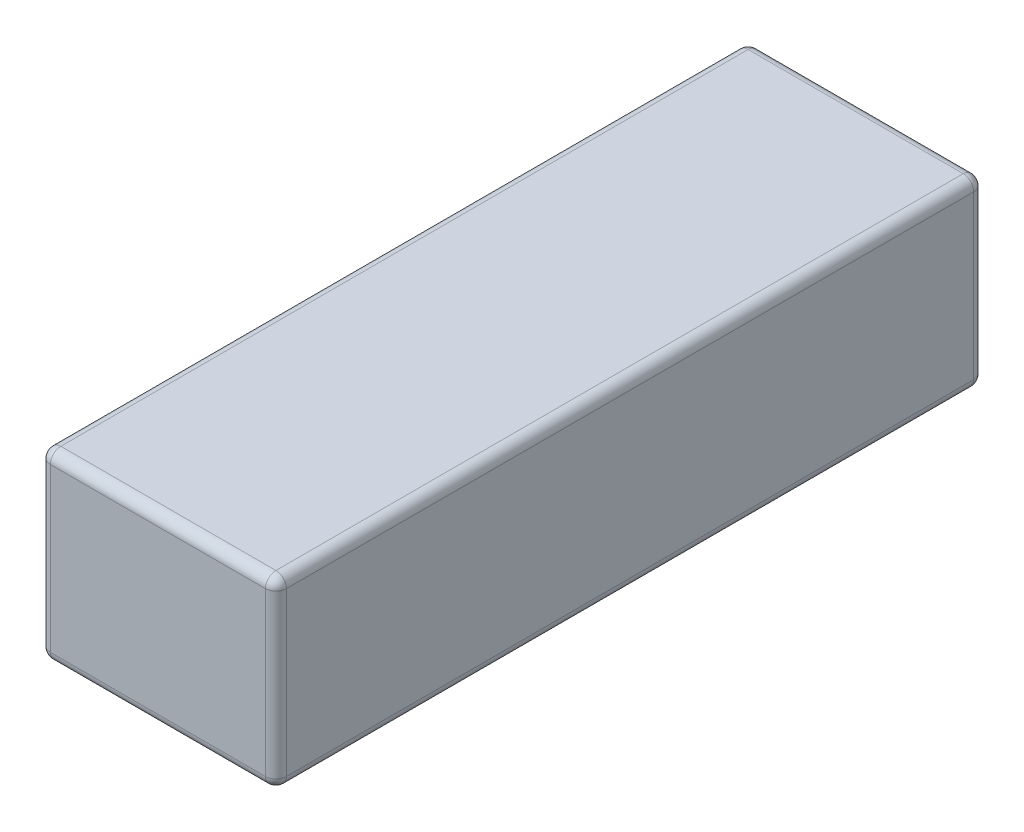
ISO-10303-21;
HEADER;
FILE_DESCRIPTION(('STEP AP214'),'2;1');
FILE_NAME('part.step','',(''),(''),'','','');
FILE_SCHEMA(('AUTOMOTIVE_DESIGN { 1 0 10303 214 1 1 1 1 }'));
ENDSEC;
DATA;
#1=APPLICATION_CONTEXT('core data for automotive mechanical design processes');
#2=APPLICATION_PROTOCOL_DEFINITION('international standard','automotive_design',2000,#1);
#3=PRODUCT_CONTEXT('',#1,'mechanical');
#4=PRODUCT('Part','Part','',(#3));
#5=PRODUCT_RELATED_PRODUCT_CATEGORY('part','',(#4));
#6=PRODUCT_DEFINITION_FORMATION('','',#4);
#7=PRODUCT_DEFINITION_CONTEXT('part definition',#1,'design');
#8=PRODUCT_DEFINITION('design','',#6,#7);
#9=PRODUCT_DEFINITION_SHAPE('','',#8);
#10=(LENGTH_UNIT() NAMED_UNIT(*) SI_UNIT(.MILLI.,.METRE.));
#11=(NAMED_UNIT(*) PLANE_ANGLE_UNIT() SI_UNIT($,.RADIAN.));
#12=(NAMED_UNIT(*) SI_UNIT($,.STERADIAN.) SOLID_ANGLE_UNIT());
#13=UNCERTAINTY_MEASURE_WITH_UNIT(LENGTH_MEASURE(1.E-05),#10,'distance_accuracy_value','');
#14=(GEOMETRIC_REPRESENTATION_CONTEXT(3) GLOBAL_UNCERTAINTY_ASSIGNED_CONTEXT((#13)) GLOBAL_UNIT_ASSIGNED_CONTEXT((#10,
#11,#12)) REPRESENTATION_CONTEXT('',''));
#15=CARTESIAN_POINT('',(0.,0.,0.));
#16=DIRECTION('',(0.,0.,1.));
#17=DIRECTION('',(1.,0.,0.));
#18=AXIS2_PLACEMENT_3D('',#15,#16,#17);
#19=CARTESIAN_POINT('',(22.5,17.5,67.5));
#20=DIRECTION('',(-1.,0.,0.));
#21=DIRECTION('',(0.,0.,1.));
#22=AXIS2_PLACEMENT_3D('',#19,#20,#21);
#23=PLANE('',#22);
#24=DIRECTION('',(0.,1.,0.));
#25=VECTOR('',#24,1.);
#26=CARTESIAN_POINT('',(22.5,-17.5,65.5));
#27=LINE('',#26,#25);
#28=CARTESIAN_POINT('',(22.5,15.5,65.5));
#29=VERTEX_POINT('',#28);
#30=CARTESIAN_POINT('',(22.5,-15.5,65.5));
#31=VERTEX_POINT('',#30);
#32=EDGE_CURVE('E132',#29,#31,#27,.F.);
#33=ORIENTED_EDGE('',*,*,#32,.T.);
#34=DIRECTION('',(0.,0.,-1.));
#35=VECTOR('',#34,1.);
#36=CARTESIAN_POINT('',(22.5,-15.5,67.5));
#37=LINE('',#36,#35);
#38=CARTESIAN_POINT('',(22.5,-15.5,-65.5));
#39=VERTEX_POINT('',#38);
#40=EDGE_CURVE('E169',#31,#39,#37,.T.);
#41=ORIENTED_EDGE('',*,*,#40,.T.);
#42=DIRECTION('',(0.,1.,0.));
#43=VECTOR('',#42,1.);
#44=CARTESIAN_POINT('',(22.5,17.5,-65.5));
#45=LINE('',#44,#43);
#46=CARTESIAN_POINT('',(22.5,15.5,-65.5));
#47=VERTEX_POINT('',#46);
#48=EDGE_CURVE('E166',#39,#47,#45,.T.);
#49=ORIENTED_EDGE('',*,*,#48,.T.);
#50=DIRECTION('',(0.,0.,-1.));
#51=VECTOR('',#50,1.);
#52=CARTESIAN_POINT('',(22.5,15.5,67.5));
#53=LINE('',#52,#51);
#54=EDGE_CURVE('E161',#47,#29,#53,.F.);
#55=ORIENTED_EDGE('',*,*,#54,.T.);
#56=EDGE_LOOP('',(#33,#41,#49,#55));
#57=FACE_BOUND('',#56,.T.);
#58=ADVANCED_FACE('F34',(#57),#23,.F.);
#59=CARTESIAN_POINT('',(-22.5,17.5,67.5));
#60=DIRECTION('',(0.,-1.,0.));
#61=DIRECTION('',(0.,0.,-1.));
#62=AXIS2_PLACEMENT_3D('',#59,#60,#61);
#63=PLANE('',#62);
#64=DIRECTION('',(0.,0.,-1.));
#65=VECTOR('',#64,1.);
#66=CARTESIAN_POINT('',(20.5,17.5,67.5));
#67=LINE('',#66,#65);
#68=CARTESIAN_POINT('',(20.5,17.5,65.5));
#69=VERTEX_POINT('',#68);
#70=CARTESIAN_POINT('',(20.5,17.5,-65.5));
#71=VERTEX_POINT('',#70);
#72=EDGE_CURVE('E57',#69,#71,#67,.T.);
#73=ORIENTED_EDGE('',*,*,#72,.T.);
#74=DIRECTION('',(-1.,0.,0.));
#75=VECTOR('',#74,1.);
#76=CARTESIAN_POINT('',(-22.5,17.5,-65.5));
#77=LINE('',#76,#75);
#78=CARTESIAN_POINT('',(-20.5,17.5,-65.5));
#79=VERTEX_POINT('',#78);
#80=EDGE_CURVE('E11',#71,#79,#77,.T.);
#81=ORIENTED_EDGE('',*,*,#80,.T.);
#82=DIRECTION('',(0.,0.,-1.));
#83=VECTOR('',#82,1.);
#84=CARTESIAN_POINT('',(-20.5,17.5,67.5));
#85=LINE('',#84,#83);
#86=CARTESIAN_POINT('',(-20.5,17.5,65.5));
#87=VERTEX_POINT('',#86);
#88=EDGE_CURVE('E43',#79,#87,#85,.F.);
#89=ORIENTED_EDGE('',*,*,#88,.T.);
#90=DIRECTION('',(-1.,0.,0.));
#91=VECTOR('',#90,1.);
#92=CARTESIAN_POINT('',(22.5,17.5,65.5));
#93=LINE('',#92,#91);
#94=EDGE_CURVE('E198',#87,#69,#93,.F.);
#95=ORIENTED_EDGE('',*,*,#94,.T.);
#96=EDGE_LOOP('',(#73,#81,#89,#95));
#97=FACE_BOUND('',#96,.T.);
#98=ADVANCED_FACE('F332',(#97),#63,.F.);
#99=CARTESIAN_POINT('',(-22.5,17.5,67.5));
#100=DIRECTION('',(1.,0.,0.));
#101=DIRECTION('',(0.,0.,-1.));
#102=AXIS2_PLACEMENT_3D('',#99,#100,#101);
#103=PLANE('',#102);
#104=DIRECTION('',(0.,-1.,0.));
#105=VECTOR('',#104,1.);
#106=CARTESIAN_POINT('',(-22.5,17.5,-65.5));
#107=LINE('',#106,#105);
#108=CARTESIAN_POINT('',(-22.5,15.5,-65.5));
#109=VERTEX_POINT('',#108);
#110=CARTESIAN_POINT('',(-22.5,-15.5,-65.5));
#111=VERTEX_POINT('',#110);
#112=EDGE_CURVE('E173',#109,#111,#107,.T.);
#113=ORIENTED_EDGE('',*,*,#112,.T.);
#114=DIRECTION('',(0.,0.,-1.));
#115=VECTOR('',#114,1.);
#116=CARTESIAN_POINT('',(-22.5,-15.5,67.5));
#117=LINE('',#116,#115);
#118=CARTESIAN_POINT('',(-22.5,-15.5,65.5));
#119=VERTEX_POINT('',#118);
#120=EDGE_CURVE('E178',#111,#119,#117,.F.);
#121=ORIENTED_EDGE('',*,*,#120,.T.);
#122=DIRECTION('',(0.,-1.,0.));
#123=VECTOR('',#122,1.);
#124=CARTESIAN_POINT('',(-22.5,17.5,65.5));
#125=LINE('',#124,#123);
#126=CARTESIAN_POINT('',(-22.5,15.5,65.5));
#127=VERTEX_POINT('',#126);
#128=EDGE_CURVE('E175',#119,#127,#125,.F.);
#129=ORIENTED_EDGE('',*,*,#128,.T.);
#130=DIRECTION('',(0.,0.,-1.));
#131=VECTOR('',#130,1.);
#132=CARTESIAN_POINT('',(-22.5,15.5,67.5));
#133=LINE('',#132,#131);
#134=EDGE_CURVE('E171',#127,#109,#133,.T.);
#135=ORIENTED_EDGE('',*,*,#134,.T.);
#136=EDGE_LOOP('',(#113,#121,#129,#135));
#137=FACE_BOUND('',#136,.T.);
#138=ADVANCED_FACE('F282',(#137),#103,.F.);
#139=CARTESIAN_POINT('',(-22.5,-17.5,67.5));
#140=DIRECTION('',(0.,1.,0.));
#141=DIRECTION('',(0.,0.,1.));
#142=AXIS2_PLACEMENT_3D('',#139,#140,#141);
#143=PLANE('',#142);
#144=DIRECTION('',(1.,0.,0.));
#145=VECTOR('',#144,1.);
#146=CARTESIAN_POINT('',(-22.5,-17.5,65.5));
#147=LINE('',#146,#145);
#148=CARTESIAN_POINT('',(20.5,-17.5,65.5));
#149=VERTEX_POINT('',#148);
#150=CARTESIAN_POINT('',(-20.5,-17.5,65.5));
#151=VERTEX_POINT('',#150);
#152=EDGE_CURVE('E191',#149,#151,#147,.F.);
#153=ORIENTED_EDGE('',*,*,#152,.T.);
#154=DIRECTION('',(0.,0.,-1.));
#155=VECTOR('',#154,1.);
#156=CARTESIAN_POINT('',(-20.5,-17.5,67.5));
#157=LINE('',#156,#155);
#158=CARTESIAN_POINT('',(-20.5,-17.5,-65.5));
#159=VERTEX_POINT('',#158);
#160=EDGE_CURVE('E196',#151,#159,#157,.T.);
#161=ORIENTED_EDGE('',*,*,#160,.T.);
#162=DIRECTION('',(1.,0.,0.));
#163=VECTOR('',#162,1.);
#164=CARTESIAN_POINT('',(-22.5,-17.5,-65.5));
#165=LINE('',#164,#163);
#166=CARTESIAN_POINT('',(20.5,-17.5,-65.5));
#167=VERTEX_POINT('',#166);
#168=EDGE_CURVE('E193',#159,#167,#165,.T.);
#169=ORIENTED_EDGE('',*,*,#168,.T.);
#170=DIRECTION('',(0.,0.,-1.));
#171=VECTOR('',#170,1.);
#172=CARTESIAN_POINT('',(20.5,-17.5,67.5));
#173=LINE('',#172,#171);
#174=EDGE_CURVE('E189',#167,#149,#173,.F.);
#175=ORIENTED_EDGE('',*,*,#174,.T.);
#176=EDGE_LOOP('',(#153,#161,#169,#175));
#177=FACE_BOUND('',#176,.T.);
#178=ADVANCED_FACE('F274',(#177),#143,.F.);
#179=CARTESIAN_POINT('',(0.,0.,67.5));
#180=DIRECTION('',(0.,0.,1.));
#181=DIRECTION('',(1.,0.,0.));
#182=AXIS2_PLACEMENT_3D('',#179,#180,#181);
#183=PLANE('',#182);
#184=DIRECTION('',(0.,-1.,0.));
#185=VECTOR('',#184,1.);
#186=CARTESIAN_POINT('',(-20.5,-17.5,67.5));
#187=LINE('',#186,#185);
#188=CARTESIAN_POINT('',(-20.5,15.5,67.5));
#189=VERTEX_POINT('',#188);
#190=CARTESIAN_POINT('',(-20.5,-15.5,67.5));
#191=VERTEX_POINT('',#190);
#192=EDGE_CURVE('E154',#189,#191,#187,.T.);
#193=ORIENTED_EDGE('',*,*,#192,.T.);
#194=DIRECTION('',(1.,0.,0.));
#195=VECTOR('',#194,1.);
#196=CARTESIAN_POINT('',(22.5,-15.5,67.5));
#197=LINE('',#196,#195);
#198=CARTESIAN_POINT('',(20.5,-15.5,67.5));
#199=VERTEX_POINT('',#198);
#200=EDGE_CURVE('E158',#191,#199,#197,.T.);
#201=ORIENTED_EDGE('',*,*,#200,.T.);
#202=DIRECTION('',(0.,1.,0.));
#203=VECTOR('',#202,1.);
#204=CARTESIAN_POINT('',(20.5,17.5,67.5));
#205=LINE('',#204,#203);
#206=CARTESIAN_POINT('',(20.5,15.5,67.5));
#207=VERTEX_POINT('',#206);
#208=EDGE_CURVE('E130',#199,#207,#205,.T.);
#209=ORIENTED_EDGE('',*,*,#208,.T.);
#210=DIRECTION('',(-1.,0.,0.));
#211=VECTOR('',#210,1.);
#212=CARTESIAN_POINT('',(-22.5,15.5,67.5));
#213=LINE('',#212,#211);
#214=EDGE_CURVE('E148',#207,#189,#213,.T.);
#215=ORIENTED_EDGE('',*,*,#214,.T.);
#216=EDGE_LOOP('',(#193,#201,#209,#215));
#217=FACE_BOUND('',#216,.T.);
#218=ADVANCED_FACE('F156',(#217),#183,.T.);
#219=CARTESIAN_POINT('',(0.,0.,-67.5));
#220=DIRECTION('',(0.,0.,1.));
#221=DIRECTION('',(1.,0.,0.));
#222=AXIS2_PLACEMENT_3D('',#219,#220,#221);
#223=PLANE('',#222);
#224=DIRECTION('',(0.,1.,0.));
#225=VECTOR('',#224,1.);
#226=CARTESIAN_POINT('',(20.5,0.,-67.5));
#227=LINE('',#226,#225);
#228=CARTESIAN_POINT('',(20.5,15.5,-67.5));
#229=VERTEX_POINT('',#228);
#230=CARTESIAN_POINT('',(20.5,-15.5,-67.5));
#231=VERTEX_POINT('',#230);
#232=EDGE_CURVE('E182',#229,#231,#227,.F.);
#233=ORIENTED_EDGE('',*,*,#232,.T.);
#234=DIRECTION('',(1.,0.,0.));
#235=VECTOR('',#234,1.);
#236=CARTESIAN_POINT('',(0.,-15.5,-67.5));
#237=LINE('',#236,#235);
#238=CARTESIAN_POINT('',(-20.5,-15.5,-67.5));
#239=VERTEX_POINT('',#238);
#240=EDGE_CURVE('E187',#231,#239,#237,.F.);
#241=ORIENTED_EDGE('',*,*,#240,.T.);
#242=DIRECTION('',(0.,-1.,0.));
#243=VECTOR('',#242,1.);
#244=CARTESIAN_POINT('',(-20.5,0.,-67.5));
#245=LINE('',#244,#243);
#246=CARTESIAN_POINT('',(-20.5,15.5,-67.5));
#247=VERTEX_POINT('',#246);
#248=EDGE_CURVE('E184',#239,#247,#245,.F.);
#249=ORIENTED_EDGE('',*,*,#248,.T.);
#250=DIRECTION('',(-1.,0.,0.));
#251=VECTOR('',#250,1.);
#252=CARTESIAN_POINT('',(0.,15.5,-67.5));
#253=LINE('',#252,#251);
#254=EDGE_CURVE('E180',#247,#229,#253,.F.);
#255=ORIENTED_EDGE('',*,*,#254,.T.);
#256=EDGE_LOOP('',(#233,#241,#249,#255));
#257=FACE_BOUND('',#256,.T.);
#258=ADVANCED_FACE('F292',(#257),#223,.F.);
#259=CARTESIAN_POINT('',(-20.5,17.5,-65.5));
#260=DIRECTION('',(0.,-1.,0.));
#261=DIRECTION('',(0.,0.,-1.));
#262=AXIS2_PLACEMENT_3D('',#259,#260,#261);
#263=CYLINDRICAL_SURFACE('',#262,2.);
#264=CARTESIAN_POINT('',(-20.5,-15.5,-65.5));
#265=DIRECTION('',(0.,-1.,0.));
#266=DIRECTION('',(0.,0.,-1.));
#267=AXIS2_PLACEMENT_3D('',#264,#265,#266);
#268=CIRCLE('',#267,2.);
#269=EDGE_CURVE('E38',#111,#239,#268,.T.);
#270=ORIENTED_EDGE('',*,*,#269,.F.);
#271=ORIENTED_EDGE('',*,*,#112,.F.);
#272=CARTESIAN_POINT('',(-20.5,15.5,-65.5));
#273=DIRECTION('',(0.,1.,0.));
#274=DIRECTION('',(0.,0.,1.));
#275=AXIS2_PLACEMENT_3D('',#272,#273,#274);
#276=CIRCLE('',#275,2.);
#277=EDGE_CURVE('E252',#247,#109,#276,.T.);
#278=ORIENTED_EDGE('',*,*,#277,.F.);
#279=ORIENTED_EDGE('',*,*,#248,.F.);
#280=EDGE_LOOP('',(#270,#271,#278,#279));
#281=FACE_BOUND('',#280,.T.);
#282=ADVANCED_FACE('F36',(#281),#263,.T.);
#283=CARTESIAN_POINT('',(-20.5,-15.5,-65.5));
#284=DIRECTION('',(0.,0.,1.));
#285=DIRECTION('',(1.,0.,0.));
#286=AXIS2_PLACEMENT_3D('',#283,#284,#285);
#287=SPHERICAL_SURFACE('',#286,2.);
#288=CARTESIAN_POINT('',(-20.5,-15.5,-65.5));
#289=DIRECTION('',(0.,0.,-1.));
#290=DIRECTION('',(-1.,0.,0.));
#291=AXIS2_PLACEMENT_3D('',#288,#289,#290);
#292=CIRCLE('',#291,2.);
#293=EDGE_CURVE('E247',#111,#159,#292,.F.);
#294=ORIENTED_EDGE('',*,*,#293,.F.);
#295=ORIENTED_EDGE('',*,*,#269,.T.);
#296=CARTESIAN_POINT('',(-20.5,-15.5,-65.5));
#297=DIRECTION('',(-1.,0.,0.));
#298=DIRECTION('',(0.,0.,1.));
#299=AXIS2_PLACEMENT_3D('',#296,#297,#298);
#300=CIRCLE('',#299,2.);
#301=EDGE_CURVE('E250',#159,#239,#300,.F.);
#302=ORIENTED_EDGE('',*,*,#301,.F.);
#303=EDGE_LOOP('',(#294,#295,#302));
#304=FACE_BOUND('',#303,.T.);
#305=ADVANCED_FACE('F262',(#304),#287,.T.);
#306=CARTESIAN_POINT('',(-20.5,15.5,-65.5));
#307=DIRECTION('',(0.,0.,1.));
#308=DIRECTION('',(1.,0.,0.));
#309=AXIS2_PLACEMENT_3D('',#306,#307,#308);
#310=SPHERICAL_SURFACE('',#309,2.);
#311=CARTESIAN_POINT('',(-20.5,15.5,-65.5));
#312=DIRECTION('',(-1.,0.,0.));
#313=DIRECTION('',(0.,0.,1.));
#314=AXIS2_PLACEMENT_3D('',#311,#312,#313);
#315=CIRCLE('',#314,2.);
#316=EDGE_CURVE('E242',#247,#79,#315,.F.);
#317=ORIENTED_EDGE('',*,*,#316,.F.);
#318=ORIENTED_EDGE('',*,*,#277,.T.);
#319=CARTESIAN_POINT('',(-20.5,15.5,-65.5));
#320=DIRECTION('',(0.,0.,-1.));
#321=DIRECTION('',(-1.,0.,0.));
#322=AXIS2_PLACEMENT_3D('',#319,#320,#321);
#323=CIRCLE('',#322,2.);
#324=EDGE_CURVE('E245',#79,#109,#323,.F.);
#325=ORIENTED_EDGE('',*,*,#324,.F.);
#326=EDGE_LOOP('',(#317,#318,#325));
#327=FACE_BOUND('',#326,.T.);
#328=ADVANCED_FACE('F459',(#327),#310,.T.);
#329=CARTESIAN_POINT('',(-22.5,-15.5,-65.5));
#330=DIRECTION('',(1.,0.,0.));
#331=DIRECTION('',(0.,0.,-1.));
#332=AXIS2_PLACEMENT_3D('',#329,#330,#331);
#333=CYLINDRICAL_SURFACE('',#332,2.);
#334=ORIENTED_EDGE('',*,*,#301,.T.);
#335=ORIENTED_EDGE('',*,*,#240,.F.);
#336=CARTESIAN_POINT('',(20.5,-15.5,-65.5));
#337=DIRECTION('',(1.,0.,0.));
#338=DIRECTION('',(0.,0.,-1.));
#339=AXIS2_PLACEMENT_3D('',#336,#337,#338);
#340=CIRCLE('',#339,2.);
#341=EDGE_CURVE('E236',#167,#231,#340,.T.);
#342=ORIENTED_EDGE('',*,*,#341,.F.);
#343=ORIENTED_EDGE('',*,*,#168,.F.);
#344=EDGE_LOOP('',(#334,#335,#342,#343));
#345=FACE_BOUND('',#344,.T.);
#346=ADVANCED_FACE('F270',(#345),#333,.T.);
#347=CARTESIAN_POINT('',(-20.5,-15.5,67.5));
#348=DIRECTION('',(0.,0.,-1.));
#349=DIRECTION('',(-1.,0.,0.));
#350=AXIS2_PLACEMENT_3D('',#347,#348,#349);
#351=CYLINDRICAL_SURFACE('',#350,2.);
#352=ORIENTED_EDGE('',*,*,#293,.T.);
#353=ORIENTED_EDGE('',*,*,#160,.F.);
#354=CARTESIAN_POINT('',(-20.5,-15.5,65.5));
#355=DIRECTION('',(0.,0.,1.));
#356=DIRECTION('',(1.,0.,0.));
#357=AXIS2_PLACEMENT_3D('',#354,#355,#356);
#358=CIRCLE('',#357,2.);
#359=EDGE_CURVE('E233',#119,#151,#358,.T.);
#360=ORIENTED_EDGE('',*,*,#359,.F.);
#361=ORIENTED_EDGE('',*,*,#120,.F.);
#362=EDGE_LOOP('',(#352,#353,#360,#361));
#363=FACE_BOUND('',#362,.T.);
#364=ADVANCED_FACE('F279',(#363),#351,.T.);
#365=CARTESIAN_POINT('',(-20.5,0.,65.5));
#366=DIRECTION('',(0.,1.,0.));
#367=DIRECTION('',(0.,0.,1.));
#368=AXIS2_PLACEMENT_3D('',#365,#366,#367);
#369=CYLINDRICAL_SURFACE('',#368,2.);
#370=CARTESIAN_POINT('',(-20.5,15.5,65.5));
#371=DIRECTION('',(0.,1.,0.));
#372=DIRECTION('',(0.,0.,1.));
#373=AXIS2_PLACEMENT_3D('',#370,#371,#372);
#374=CIRCLE('',#373,2.);
#375=EDGE_CURVE('E227',#127,#189,#374,.T.);
#376=ORIENTED_EDGE('',*,*,#375,.F.);
#377=ORIENTED_EDGE('',*,*,#128,.F.);
#378=CARTESIAN_POINT('',(-20.5,-15.5,65.5));
#379=DIRECTION('',(0.,-1.,0.));
#380=DIRECTION('',(0.,0.,-1.));
#381=AXIS2_PLACEMENT_3D('',#378,#379,#380);
#382=CIRCLE('',#381,2.);
#383=EDGE_CURVE('E230',#191,#119,#382,.T.);
#384=ORIENTED_EDGE('',*,*,#383,.F.);
#385=ORIENTED_EDGE('',*,*,#192,.F.);
#386=EDGE_LOOP('',(#376,#377,#384,#385));
#387=FACE_BOUND('',#386,.T.);
#388=ADVANCED_FACE('F286',(#387),#369,.T.);
#389=CARTESIAN_POINT('',(-20.5,15.5,67.5));
#390=DIRECTION('',(0.,0.,-1.));
#391=DIRECTION('',(-1.,0.,0.));
#392=AXIS2_PLACEMENT_3D('',#389,#390,#391);
#393=CYLINDRICAL_SURFACE('',#392,2.);
#394=ORIENTED_EDGE('',*,*,#324,.T.);
#395=ORIENTED_EDGE('',*,*,#134,.F.);
#396=CARTESIAN_POINT('',(-20.5,15.5,65.5));
#397=DIRECTION('',(0.,0.,1.));
#398=DIRECTION('',(1.,0.,0.));
#399=AXIS2_PLACEMENT_3D('',#396,#397,#398);
#400=CIRCLE('',#399,2.);
#401=EDGE_CURVE('E225',#87,#127,#400,.T.);
#402=ORIENTED_EDGE('',*,*,#401,.F.);
#403=ORIENTED_EDGE('',*,*,#88,.F.);
#404=EDGE_LOOP('',(#394,#395,#402,#403));
#405=FACE_BOUND('',#404,.T.);
#406=ADVANCED_FACE('F290',(#405),#393,.T.);
#407=CARTESIAN_POINT('',(-22.5,15.5,-65.5));
#408=DIRECTION('',(-1.,0.,0.));
#409=DIRECTION('',(0.,0.,1.));
#410=AXIS2_PLACEMENT_3D('',#407,#408,#409);
#411=CYLINDRICAL_SURFACE('',#410,2.);
#412=ORIENTED_EDGE('',*,*,#316,.T.);
#413=ORIENTED_EDGE('',*,*,#80,.F.);
#414=CARTESIAN_POINT('',(20.5,15.5,-65.5));
#415=DIRECTION('',(1.,0.,0.));
#416=DIRECTION('',(0.,0.,-1.));
#417=AXIS2_PLACEMENT_3D('',#414,#415,#416);
#418=CIRCLE('',#417,2.);
#419=EDGE_CURVE('E222',#229,#71,#418,.T.);
#420=ORIENTED_EDGE('',*,*,#419,.F.);
#421=ORIENTED_EDGE('',*,*,#254,.F.);
#422=EDGE_LOOP('',(#412,#413,#420,#421));
#423=FACE_BOUND('',#422,.T.);
#424=ADVANCED_FACE('F301',(#423),#411,.T.);
#425=CARTESIAN_POINT('',(20.5,17.5,-65.5));
#426=DIRECTION('',(0.,1.,0.));
#427=DIRECTION('',(0.,0.,1.));
#428=AXIS2_PLACEMENT_3D('',#425,#426,#427);
#429=CYLINDRICAL_SURFACE('',#428,2.);
#430=CARTESIAN_POINT('',(20.5,-15.5,-65.5));
#431=DIRECTION('',(0.,-1.,0.));
#432=DIRECTION('',(1.,0.,0.));
#433=AXIS2_PLACEMENT_3D('',#430,#431,#432);
#434=CIRCLE('',#433,2.);
#435=EDGE_CURVE('E239',#231,#39,#434,.T.);
#436=ORIENTED_EDGE('',*,*,#435,.F.);
#437=ORIENTED_EDGE('',*,*,#232,.F.);
#438=CARTESIAN_POINT('',(20.5,15.5,-65.5));
#439=DIRECTION('',(0.,1.,0.));
#440=DIRECTION('',(0.,0.,1.));
#441=AXIS2_PLACEMENT_3D('',#438,#439,#440);
#442=CIRCLE('',#441,2.);
#443=EDGE_CURVE('E219',#47,#229,#442,.T.);
#444=ORIENTED_EDGE('',*,*,#443,.F.);
#445=ORIENTED_EDGE('',*,*,#48,.F.);
#446=EDGE_LOOP('',(#436,#437,#444,#445));
#447=FACE_BOUND('',#446,.T.);
#448=ADVANCED_FACE('F297',(#447),#429,.T.);
#449=CARTESIAN_POINT('',(20.5,-15.5,-65.5));
#450=DIRECTION('',(0.,0.,1.));
#451=DIRECTION('',(1.,0.,0.));
#452=AXIS2_PLACEMENT_3D('',#449,#450,#451);
#453=SPHERICAL_SURFACE('',#452,2.);
#454=ORIENTED_EDGE('',*,*,#341,.T.);
#455=ORIENTED_EDGE('',*,*,#435,.T.);
#456=CARTESIAN_POINT('',(20.5,-15.5,-65.5));
#457=DIRECTION('',(0.,0.,-1.));
#458=DIRECTION('',(-1.,0.,0.));
#459=AXIS2_PLACEMENT_3D('',#456,#457,#458);
#460=CIRCLE('',#459,2.);
#461=EDGE_CURVE('E216',#167,#39,#460,.F.);
#462=ORIENTED_EDGE('',*,*,#461,.F.);
#463=EDGE_LOOP('',(#454,#455,#462));
#464=FACE_BOUND('',#463,.T.);
#465=ADVANCED_FACE('F311',(#464),#453,.T.);
#466=CARTESIAN_POINT('',(-20.5,-15.5,65.5));
#467=DIRECTION('',(0.,0.,1.));
#468=DIRECTION('',(1.,0.,0.));
#469=AXIS2_PLACEMENT_3D('',#466,#467,#468);
#470=SPHERICAL_SURFACE('',#469,2.);
#471=ORIENTED_EDGE('',*,*,#383,.T.);
#472=ORIENTED_EDGE('',*,*,#359,.T.);
#473=CARTESIAN_POINT('',(-20.5,-15.5,65.5));
#474=DIRECTION('',(-1.,0.,0.));
#475=DIRECTION('',(0.,0.,1.));
#476=AXIS2_PLACEMENT_3D('',#473,#474,#475);
#477=CIRCLE('',#476,2.);
#478=EDGE_CURVE('E213',#191,#151,#477,.F.);
#479=ORIENTED_EDGE('',*,*,#478,.F.);
#480=EDGE_LOOP('',(#471,#472,#479));
#481=FACE_BOUND('',#480,.T.);
#482=ADVANCED_FACE('F321',(#481),#470,.T.);
#483=CARTESIAN_POINT('',(-20.5,15.5,65.5));
#484=DIRECTION('',(0.,0.,1.));
#485=DIRECTION('',(1.,0.,0.));
#486=AXIS2_PLACEMENT_3D('',#483,#484,#485);
#487=SPHERICAL_SURFACE('',#486,2.);
#488=ORIENTED_EDGE('',*,*,#401,.T.);
#489=ORIENTED_EDGE('',*,*,#375,.T.);
#490=CARTESIAN_POINT('',(-20.5,15.5,65.5));
#491=DIRECTION('',(-1.,0.,0.));
#492=DIRECTION('',(0.,0.,1.));
#493=AXIS2_PLACEMENT_3D('',#490,#491,#492);
#494=CIRCLE('',#493,2.);
#495=EDGE_CURVE('E151',#87,#189,#494,.F.);
#496=ORIENTED_EDGE('',*,*,#495,.F.);
#497=EDGE_LOOP('',(#488,#489,#496));
#498=FACE_BOUND('',#497,.T.);
#499=ADVANCED_FACE('F323',(#498),#487,.T.);
#500=CARTESIAN_POINT('',(20.5,15.5,-65.5));
#501=DIRECTION('',(0.,0.,1.));
#502=DIRECTION('',(1.,0.,0.));
#503=AXIS2_PLACEMENT_3D('',#500,#501,#502);
#504=SPHERICAL_SURFACE('',#503,2.);
#505=ORIENTED_EDGE('',*,*,#443,.T.);
#506=ORIENTED_EDGE('',*,*,#419,.T.);
#507=CARTESIAN_POINT('',(20.5,15.5,-65.5));
#508=DIRECTION('',(0.,0.,-1.));
#509=DIRECTION('',(-1.,0.,0.));
#510=AXIS2_PLACEMENT_3D('',#507,#508,#509);
#511=CIRCLE('',#510,2.);
#512=EDGE_CURVE('E209',#47,#71,#511,.F.);
#513=ORIENTED_EDGE('',*,*,#512,.F.);
#514=EDGE_LOOP('',(#505,#506,#513));
#515=FACE_BOUND('',#514,.T.);
#516=ADVANCED_FACE('F303',(#515),#504,.T.);
#517=CARTESIAN_POINT('',(20.5,-15.5,67.5));
#518=DIRECTION('',(0.,0.,-1.));
#519=DIRECTION('',(-1.,0.,0.));
#520=AXIS2_PLACEMENT_3D('',#517,#518,#519);
#521=CYLINDRICAL_SURFACE('',#520,2.);
#522=ORIENTED_EDGE('',*,*,#461,.T.);
#523=ORIENTED_EDGE('',*,*,#40,.F.);
#524=CARTESIAN_POINT('',(20.5,-15.5,65.5));
#525=DIRECTION('',(0.,0.,1.));
#526=DIRECTION('',(1.,0.,0.));
#527=AXIS2_PLACEMENT_3D('',#524,#525,#526);
#528=CIRCLE('',#527,2.);
#529=EDGE_CURVE('E206',#149,#31,#528,.T.);
#530=ORIENTED_EDGE('',*,*,#529,.F.);
#531=ORIENTED_EDGE('',*,*,#174,.F.);
#532=EDGE_LOOP('',(#522,#523,#530,#531));
#533=FACE_BOUND('',#532,.T.);
#534=ADVANCED_FACE('F313',(#533),#521,.T.);
#535=CARTESIAN_POINT('',(0.,-15.5,65.5));
#536=DIRECTION('',(-1.,0.,0.));
#537=DIRECTION('',(0.,0.,1.));
#538=AXIS2_PLACEMENT_3D('',#535,#536,#537);
#539=CYLINDRICAL_SURFACE('',#538,2.);
#540=ORIENTED_EDGE('',*,*,#478,.T.);
#541=ORIENTED_EDGE('',*,*,#152,.F.);
#542=CARTESIAN_POINT('',(20.5,-15.5,65.5));
#543=DIRECTION('',(1.,0.,0.));
#544=DIRECTION('',(0.,0.,-1.));
#545=AXIS2_PLACEMENT_3D('',#542,#543,#544);
#546=CIRCLE('',#545,2.);
#547=EDGE_CURVE('E145',#199,#149,#546,.T.);
#548=ORIENTED_EDGE('',*,*,#547,.F.);
#549=ORIENTED_EDGE('',*,*,#200,.F.);
#550=EDGE_LOOP('',(#540,#541,#548,#549));
#551=FACE_BOUND('',#550,.T.);
#552=ADVANCED_FACE('F319',(#551),#539,.T.);
#553=CARTESIAN_POINT('',(0.,15.5,65.5));
#554=DIRECTION('',(1.,0.,0.));
#555=DIRECTION('',(0.,0.,-1.));
#556=AXIS2_PLACEMENT_3D('',#553,#554,#555);
#557=CYLINDRICAL_SURFACE('',#556,2.);
#558=ORIENTED_EDGE('',*,*,#495,.T.);
#559=ORIENTED_EDGE('',*,*,#214,.F.);
#560=CARTESIAN_POINT('',(20.5,15.5,65.5));
#561=DIRECTION('',(1.,0.,0.));
#562=DIRECTION('',(0.,0.,-1.));
#563=AXIS2_PLACEMENT_3D('',#560,#561,#562);
#564=CIRCLE('',#563,2.);
#565=EDGE_CURVE('E138',#69,#207,#564,.T.);
#566=ORIENTED_EDGE('',*,*,#565,.F.);
#567=ORIENTED_EDGE('',*,*,#94,.F.);
#568=EDGE_LOOP('',(#558,#559,#566,#567));
#569=FACE_BOUND('',#568,.T.);
#570=ADVANCED_FACE('F149',(#569),#557,.T.);
#571=CARTESIAN_POINT('',(20.5,15.5,67.5));
#572=DIRECTION('',(0.,0.,-1.));
#573=DIRECTION('',(-1.,0.,0.));
#574=AXIS2_PLACEMENT_3D('',#571,#572,#573);
#575=CYLINDRICAL_SURFACE('',#574,2.);
#576=ORIENTED_EDGE('',*,*,#512,.T.);
#577=ORIENTED_EDGE('',*,*,#72,.F.);
#578=CARTESIAN_POINT('',(20.5,15.5,65.5));
#579=DIRECTION('',(0.,0.,1.));
#580=DIRECTION('',(1.,0.,0.));
#581=AXIS2_PLACEMENT_3D('',#578,#579,#580);
#582=CIRCLE('',#581,2.);
#583=EDGE_CURVE('E142',#29,#69,#582,.T.);
#584=ORIENTED_EDGE('',*,*,#583,.F.);
#585=ORIENTED_EDGE('',*,*,#54,.F.);
#586=EDGE_LOOP('',(#576,#577,#584,#585));
#587=FACE_BOUND('',#586,.T.);
#588=ADVANCED_FACE('F306',(#587),#575,.T.);
#589=CARTESIAN_POINT('',(20.5,-15.5,65.5));
#590=DIRECTION('',(0.,0.,1.));
#591=DIRECTION('',(1.,0.,0.));
#592=AXIS2_PLACEMENT_3D('',#589,#590,#591);
#593=SPHERICAL_SURFACE('',#592,2.);
#594=ORIENTED_EDGE('',*,*,#547,.T.);
#595=ORIENTED_EDGE('',*,*,#529,.T.);
#596=CARTESIAN_POINT('',(20.5,-15.5,65.5));
#597=DIRECTION('',(0.,-1.,0.));
#598=DIRECTION('',(0.,0.,-1.));
#599=AXIS2_PLACEMENT_3D('',#596,#597,#598);
#600=CIRCLE('',#599,2.);
#601=EDGE_CURVE('E135',#199,#31,#600,.F.);
#602=ORIENTED_EDGE('',*,*,#601,.F.);
#603=EDGE_LOOP('',(#594,#595,#602));
#604=FACE_BOUND('',#603,.T.);
#605=ADVANCED_FACE('F317',(#604),#593,.T.);
#606=CARTESIAN_POINT('',(20.5,15.5,65.5));
#607=DIRECTION('',(0.,0.,1.));
#608=DIRECTION('',(1.,0.,0.));
#609=AXIS2_PLACEMENT_3D('',#606,#607,#608);
#610=SPHERICAL_SURFACE('',#609,2.);
#611=ORIENTED_EDGE('',*,*,#583,.T.);
#612=ORIENTED_EDGE('',*,*,#565,.T.);
#613=CARTESIAN_POINT('',(20.5,15.5,65.5));
#614=DIRECTION('',(0.,1.,0.));
#615=DIRECTION('',(0.,0.,1.));
#616=AXIS2_PLACEMENT_3D('',#613,#614,#615);
#617=CIRCLE('',#616,2.);
#618=EDGE_CURVE('E126',#29,#207,#617,.F.);
#619=ORIENTED_EDGE('',*,*,#618,.F.);
#620=EDGE_LOOP('',(#611,#612,#619));
#621=FACE_BOUND('',#620,.T.);
#622=ADVANCED_FACE('F140',(#621),#610,.T.);
#623=CARTESIAN_POINT('',(20.5,0.,65.5));
#624=DIRECTION('',(0.,-1.,0.));
#625=DIRECTION('',(0.,0.,-1.));
#626=AXIS2_PLACEMENT_3D('',#623,#624,#625);
#627=CYLINDRICAL_SURFACE('',#626,2.);
#628=ORIENTED_EDGE('',*,*,#601,.T.);
#629=ORIENTED_EDGE('',*,*,#32,.F.);
#630=ORIENTED_EDGE('',*,*,#618,.T.);
#631=ORIENTED_EDGE('',*,*,#208,.F.);
#632=EDGE_LOOP('',(#628,#629,#630,#631));
#633=FACE_BOUND('',#632,.T.);
#634=ADVANCED_FACE('F128',(#633),#627,.T.);
#635=CLOSED_SHELL('',(#58,#98,#138,#178,#218,#258,#282,#305,#328,#346,#364,#388,#406,#424,#448,
#465,#482,#499,#516,#534,#552,#570,#588,#605,#622,#634));
#636=MANIFOLD_SOLID_BREP('B2',#635);
#637=ADVANCED_BREP_SHAPE_REPRESENTATION('',(#18,#636),#14);
#638=SHAPE_DEFINITION_REPRESENTATION(#9,#637);
ENDSEC;
END-ISO-10303-21;
